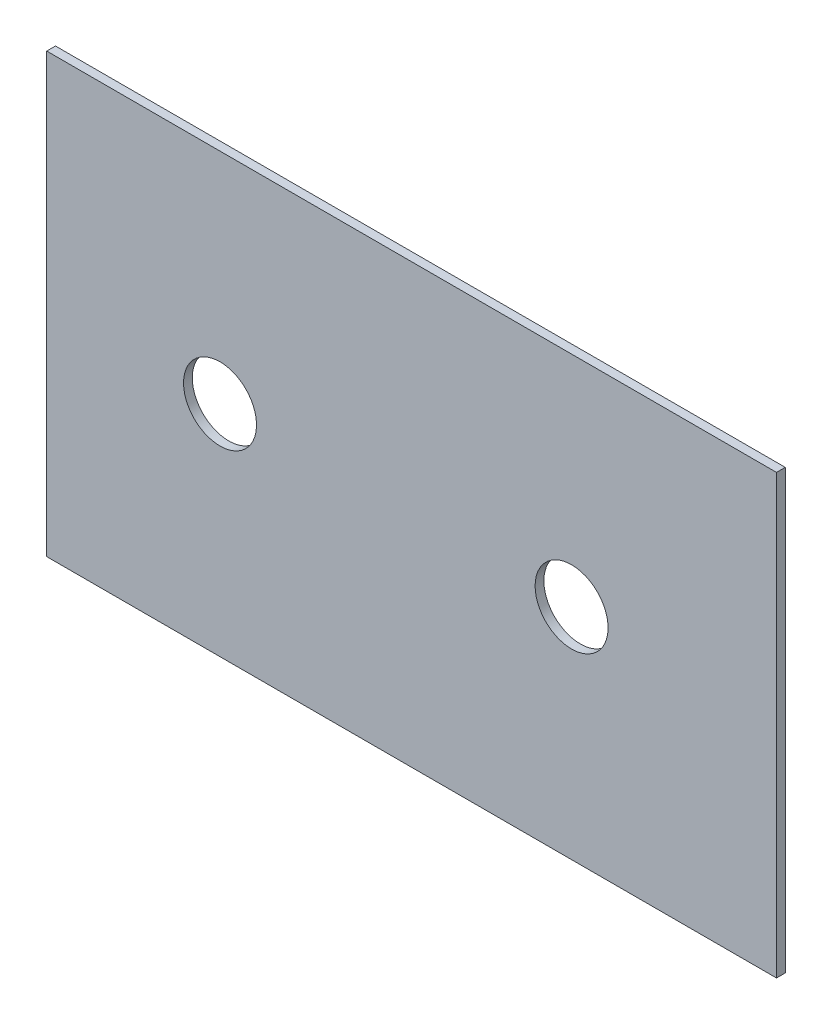
ISO-10303-21;
HEADER;
FILE_DESCRIPTION(('STEP AP214'),'2;1');
FILE_NAME('part.step','',(''),(''),'','','');
FILE_SCHEMA(('AUTOMOTIVE_DESIGN { 1 0 10303 214 1 1 1 1 }'));
ENDSEC;
DATA;
#1=APPLICATION_CONTEXT('core data for automotive mechanical design processes');
#2=APPLICATION_PROTOCOL_DEFINITION('international standard','automotive_design',2000,#1);
#3=PRODUCT_CONTEXT('',#1,'mechanical');
#4=PRODUCT('Part','Part','',(#3));
#5=PRODUCT_RELATED_PRODUCT_CATEGORY('part','',(#4));
#6=PRODUCT_DEFINITION_FORMATION('','',#4);
#7=PRODUCT_DEFINITION_CONTEXT('part definition',#1,'design');
#8=PRODUCT_DEFINITION('design','',#6,#7);
#9=PRODUCT_DEFINITION_SHAPE('','',#8);
#10=(LENGTH_UNIT() NAMED_UNIT(*) SI_UNIT(.MILLI.,.METRE.));
#11=(NAMED_UNIT(*) PLANE_ANGLE_UNIT() SI_UNIT($,.RADIAN.));
#12=(NAMED_UNIT(*) SI_UNIT($,.STERADIAN.) SOLID_ANGLE_UNIT());
#13=UNCERTAINTY_MEASURE_WITH_UNIT(LENGTH_MEASURE(1.E-05),#10,'distance_accuracy_value','');
#14=(GEOMETRIC_REPRESENTATION_CONTEXT(3) GLOBAL_UNCERTAINTY_ASSIGNED_CONTEXT((#13)) GLOBAL_UNIT_ASSIGNED_CONTEXT((#10,
#11,#12)) REPRESENTATION_CONTEXT('',''));
#15=CARTESIAN_POINT('',(0.,0.,0.));
#16=DIRECTION('',(0.,0.,1.));
#17=DIRECTION('',(1.,0.,0.));
#18=AXIS2_PLACEMENT_3D('',#15,#16,#17);
#19=CARTESIAN_POINT('',(63.5,-38.1,1.524));
#20=DIRECTION('',(-1.,0.,0.));
#21=DIRECTION('',(0.,0.,1.));
#22=AXIS2_PLACEMENT_3D('',#19,#20,#21);
#23=PLANE('',#22);
#24=DIRECTION('',(0.,1.,0.));
#25=VECTOR('',#24,1.);
#26=CARTESIAN_POINT('',(63.5,-38.1,0.));
#27=LINE('',#26,#25);
#28=CARTESIAN_POINT('',(63.5,-38.1,0.));
#29=VERTEX_POINT('',#28);
#30=CARTESIAN_POINT('',(63.5,38.1,0.));
#31=VERTEX_POINT('',#30);
#32=EDGE_CURVE('E96',#29,#31,#27,.T.);
#33=ORIENTED_EDGE('',*,*,#32,.T.);
#34=DIRECTION('',(0.,0.,-1.));
#35=VECTOR('',#34,1.);
#36=CARTESIAN_POINT('',(63.5,38.1,1.524));
#37=LINE('',#36,#35);
#38=CARTESIAN_POINT('',(63.5,38.1,1.524));
#39=VERTEX_POINT('',#38);
#40=EDGE_CURVE('E11',#39,#31,#37,.T.);
#41=ORIENTED_EDGE('',*,*,#40,.F.);
#42=DIRECTION('',(0.,1.,0.));
#43=VECTOR('',#42,1.);
#44=CARTESIAN_POINT('',(63.5,-38.1,1.524));
#45=LINE('',#44,#43);
#46=CARTESIAN_POINT('',(63.5,-38.1,1.524));
#47=VERTEX_POINT('',#46);
#48=EDGE_CURVE('E84',#47,#39,#45,.T.);
#49=ORIENTED_EDGE('',*,*,#48,.F.);
#50=DIRECTION('',(0.,0.,-1.));
#51=VECTOR('',#50,1.);
#52=CARTESIAN_POINT('',(63.5,-38.1,1.524));
#53=LINE('',#52,#51);
#54=EDGE_CURVE('E92',#47,#29,#53,.T.);
#55=ORIENTED_EDGE('',*,*,#54,.T.);
#56=EDGE_LOOP('',(#33,#41,#49,#55));
#57=FACE_BOUND('',#56,.T.);
#58=ADVANCED_FACE('F33',(#57),#23,.F.);
#59=CARTESIAN_POINT('',(-63.5,38.1,1.524));
#60=DIRECTION('',(0.,-1.,0.));
#61=DIRECTION('',(0.,0.,-1.));
#62=AXIS2_PLACEMENT_3D('',#59,#60,#61);
#63=PLANE('',#62);
#64=DIRECTION('',(-1.,0.,0.));
#65=VECTOR('',#64,1.);
#66=CARTESIAN_POINT('',(-63.5,38.1,0.));
#67=LINE('',#66,#65);
#68=CARTESIAN_POINT('',(-63.5,38.1,0.));
#69=VERTEX_POINT('',#68);
#70=EDGE_CURVE('E88',#31,#69,#67,.T.);
#71=ORIENTED_EDGE('',*,*,#70,.T.);
#72=DIRECTION('',(0.,0.,-1.));
#73=VECTOR('',#72,1.);
#74=CARTESIAN_POINT('',(-63.5,38.1,1.524));
#75=LINE('',#74,#73);
#76=CARTESIAN_POINT('',(-63.5,38.1,1.524));
#77=VERTEX_POINT('',#76);
#78=EDGE_CURVE('E41',#77,#69,#75,.T.);
#79=ORIENTED_EDGE('',*,*,#78,.F.);
#80=DIRECTION('',(-1.,0.,0.));
#81=VECTOR('',#80,1.);
#82=CARTESIAN_POINT('',(-63.5,38.1,1.524));
#83=LINE('',#82,#81);
#84=EDGE_CURVE('E79',#39,#77,#83,.T.);
#85=ORIENTED_EDGE('',*,*,#84,.F.);
#86=ORIENTED_EDGE('',*,*,#40,.T.);
#87=EDGE_LOOP('',(#71,#79,#85,#86));
#88=FACE_BOUND('',#87,.T.);
#89=ADVANCED_FACE('F87',(#88),#63,.F.);
#90=CARTESIAN_POINT('',(-63.5,-38.1,1.524));
#91=DIRECTION('',(1.,0.,0.));
#92=DIRECTION('',(0.,0.,-1.));
#93=AXIS2_PLACEMENT_3D('',#90,#91,#92);
#94=PLANE('',#93);
#95=DIRECTION('',(0.,-1.,0.));
#96=VECTOR('',#95,1.);
#97=CARTESIAN_POINT('',(-63.5,-38.1,0.));
#98=LINE('',#97,#96);
#99=CARTESIAN_POINT('',(-63.5,-38.1,0.));
#100=VERTEX_POINT('',#99);
#101=EDGE_CURVE('E66',#69,#100,#98,.T.);
#102=ORIENTED_EDGE('',*,*,#101,.T.);
#103=DIRECTION('',(0.,0.,-1.));
#104=VECTOR('',#103,1.);
#105=CARTESIAN_POINT('',(-63.5,-38.1,1.524));
#106=LINE('',#105,#104);
#107=CARTESIAN_POINT('',(-63.5,-38.1,1.524));
#108=VERTEX_POINT('',#107);
#109=EDGE_CURVE('E89',#108,#100,#106,.T.);
#110=ORIENTED_EDGE('',*,*,#109,.F.);
#111=DIRECTION('',(0.,-1.,0.));
#112=VECTOR('',#111,1.);
#113=CARTESIAN_POINT('',(-63.5,-38.1,1.524));
#114=LINE('',#113,#112);
#115=EDGE_CURVE('E82',#77,#108,#114,.T.);
#116=ORIENTED_EDGE('',*,*,#115,.F.);
#117=ORIENTED_EDGE('',*,*,#78,.T.);
#118=EDGE_LOOP('',(#102,#110,#116,#117));
#119=FACE_BOUND('',#118,.T.);
#120=ADVANCED_FACE('F90',(#119),#94,.F.);
#121=CARTESIAN_POINT('',(-63.5,-38.1,1.524));
#122=DIRECTION('',(0.,1.,0.));
#123=DIRECTION('',(0.,0.,1.));
#124=AXIS2_PLACEMENT_3D('',#121,#122,#123);
#125=PLANE('',#124);
#126=DIRECTION('',(1.,0.,0.));
#127=VECTOR('',#126,1.);
#128=CARTESIAN_POINT('',(-63.5,-38.1,0.));
#129=LINE('',#128,#127);
#130=EDGE_CURVE('E72',#100,#29,#129,.T.);
#131=ORIENTED_EDGE('',*,*,#130,.T.);
#132=ORIENTED_EDGE('',*,*,#54,.F.);
#133=DIRECTION('',(1.,0.,0.));
#134=VECTOR('',#133,1.);
#135=CARTESIAN_POINT('',(-63.5,-38.1,1.524));
#136=LINE('',#135,#134);
#137=EDGE_CURVE('E49',#108,#47,#136,.T.);
#138=ORIENTED_EDGE('',*,*,#137,.F.);
#139=ORIENTED_EDGE('',*,*,#109,.T.);
#140=EDGE_LOOP('',(#131,#132,#138,#139));
#141=FACE_BOUND('',#140,.T.);
#142=ADVANCED_FACE('F104',(#141),#125,.F.);
#143=CARTESIAN_POINT('',(0.,0.,1.524));
#144=DIRECTION('',(0.,0.,-1.));
#145=DIRECTION('',(-1.,0.,0.));
#146=AXIS2_PLACEMENT_3D('',#143,#144,#145);
#147=PLANE('',#146);
#148=CARTESIAN_POINT('',(-33.3441746500398,0.,1.524));
#149=DIRECTION('',(0.,0.,-1.));
#150=DIRECTION('',(-1.,0.,0.));
#151=AXIS2_PLACEMENT_3D('',#148,#149,#150);
#152=CIRCLE('',#151,6.35);
#153=CARTESIAN_POINT('',(-39.6941746500398,0.,1.524));
#154=VERTEX_POINT('',#153);
#155=EDGE_CURVE('E115',#154,#154,#152,.F.);
#156=ORIENTED_EDGE('',*,*,#155,.F.);
#157=EDGE_LOOP('',(#156));
#158=FACE_BOUND('',#157,.T.);
#159=CARTESIAN_POINT('',(27.8405565266837,0.,1.524));
#160=DIRECTION('',(0.,0.,-1.));
#161=DIRECTION('',(-1.,0.,0.));
#162=AXIS2_PLACEMENT_3D('',#159,#160,#161);
#163=CIRCLE('',#162,6.35);
#164=CARTESIAN_POINT('',(21.4905565266837,0.,1.524));
#165=VERTEX_POINT('',#164);
#166=EDGE_CURVE('E99',#165,#165,#163,.F.);
#167=ORIENTED_EDGE('',*,*,#166,.F.);
#168=EDGE_LOOP('',(#167));
#169=FACE_BOUND('',#168,.T.);
#170=ORIENTED_EDGE('',*,*,#48,.T.);
#171=ORIENTED_EDGE('',*,*,#84,.T.);
#172=ORIENTED_EDGE('',*,*,#115,.T.);
#173=ORIENTED_EDGE('',*,*,#137,.T.);
#174=EDGE_LOOP('',(#170,#171,#172,#173));
#175=FACE_BOUND('',#174,.T.);
#176=ADVANCED_FACE('F80',(#158,#169,#175),#147,.F.);
#177=CARTESIAN_POINT('',(0.,0.,0.));
#178=DIRECTION('',(0.,0.,-1.));
#179=DIRECTION('',(-1.,0.,0.));
#180=AXIS2_PLACEMENT_3D('',#177,#178,#179);
#181=PLANE('',#180);
#182=CARTESIAN_POINT('',(-33.3441746500398,0.,0.));
#183=DIRECTION('',(0.,0.,-1.));
#184=DIRECTION('',(-1.,0.,0.));
#185=AXIS2_PLACEMENT_3D('',#182,#183,#184);
#186=CIRCLE('',#185,6.35);
#187=CARTESIAN_POINT('',(-39.6941746500398,0.,0.));
#188=VERTEX_POINT('',#187);
#189=EDGE_CURVE('E118',#188,#188,#186,.T.);
#190=ORIENTED_EDGE('',*,*,#189,.F.);
#191=EDGE_LOOP('',(#190));
#192=FACE_BOUND('',#191,.T.);
#193=CARTESIAN_POINT('',(27.8405565266837,0.,0.));
#194=DIRECTION('',(0.,0.,-1.));
#195=DIRECTION('',(-1.,0.,0.));
#196=AXIS2_PLACEMENT_3D('',#193,#194,#195);
#197=CIRCLE('',#196,6.35);
#198=CARTESIAN_POINT('',(21.4905565266837,0.,0.));
#199=VERTEX_POINT('',#198);
#200=EDGE_CURVE('E112',#199,#199,#197,.T.);
#201=ORIENTED_EDGE('',*,*,#200,.F.);
#202=EDGE_LOOP('',(#201));
#203=FACE_BOUND('',#202,.T.);
#204=ORIENTED_EDGE('',*,*,#32,.F.);
#205=ORIENTED_EDGE('',*,*,#130,.F.);
#206=ORIENTED_EDGE('',*,*,#101,.F.);
#207=ORIENTED_EDGE('',*,*,#70,.F.);
#208=EDGE_LOOP('',(#204,#205,#206,#207));
#209=FACE_BOUND('',#208,.T.);
#210=ADVANCED_FACE('F107',(#192,#203,#209),#181,.T.);
#211=CARTESIAN_POINT('',(27.8405565266837,0.,19.4845122421383));
#212=DIRECTION('',(0.,0.,-1.));
#213=DIRECTION('',(-1.,0.,0.));
#214=AXIS2_PLACEMENT_3D('',#211,#212,#213);
#215=CYLINDRICAL_SURFACE('',#214,6.35);
#216=ORIENTED_EDGE('',*,*,#166,.T.);
#217=EDGE_LOOP('',(#216));
#218=FACE_BOUND('',#217,.T.);
#219=ORIENTED_EDGE('',*,*,#200,.T.);
#220=EDGE_LOOP('',(#219));
#221=FACE_BOUND('',#220,.T.);
#222=ADVANCED_FACE('F126',(#218,#221),#215,.F.);
#223=CARTESIAN_POINT('',(-33.3441746500398,0.,19.4845122421383));
#224=DIRECTION('',(0.,0.,-1.));
#225=DIRECTION('',(-1.,0.,0.));
#226=AXIS2_PLACEMENT_3D('',#223,#224,#225);
#227=CYLINDRICAL_SURFACE('',#226,6.35);
#228=ORIENTED_EDGE('',*,*,#155,.T.);
#229=EDGE_LOOP('',(#228));
#230=FACE_BOUND('',#229,.T.);
#231=ORIENTED_EDGE('',*,*,#189,.T.);
#232=EDGE_LOOP('',(#231));
#233=FACE_BOUND('',#232,.T.);
#234=ADVANCED_FACE('F122',(#230,#233),#227,.F.);
#235=CLOSED_SHELL('',(#58,#89,#120,#142,#176,#210,#222,#234));
#236=MANIFOLD_SOLID_BREP('B2',#235);
#237=ADVANCED_BREP_SHAPE_REPRESENTATION('',(#18,#236),#14);
#238=SHAPE_DEFINITION_REPRESENTATION(#9,#237);
ENDSEC;
END-ISO-10303-21;
